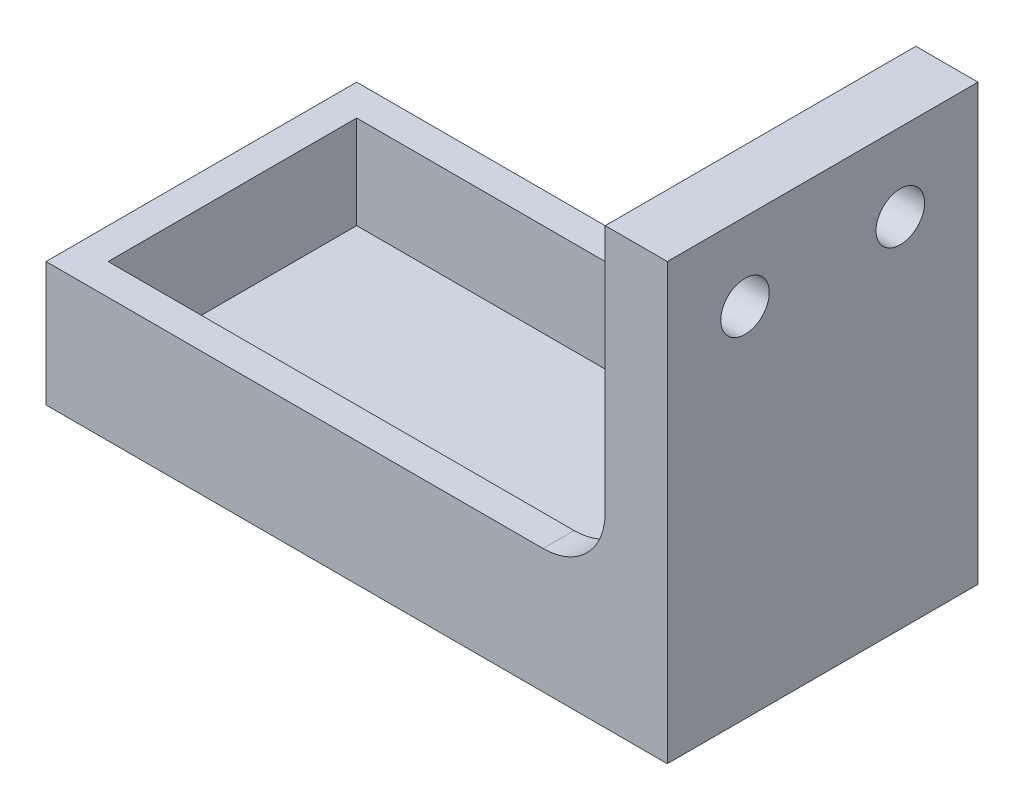
ISO-10303-21;
HEADER;
FILE_DESCRIPTION(('STEP AP214'),'2;1');
FILE_NAME('part.step','',(''),(''),'','','');
FILE_SCHEMA(('AUTOMOTIVE_DESIGN { 1 0 10303 214 1 1 1 1 }'));
ENDSEC;
DATA;
#1=APPLICATION_CONTEXT('core data for automotive mechanical design processes');
#2=APPLICATION_PROTOCOL_DEFINITION('international standard','automotive_design',2000,#1);
#3=PRODUCT_CONTEXT('',#1,'mechanical');
#4=PRODUCT('Part','Part','',(#3));
#5=PRODUCT_RELATED_PRODUCT_CATEGORY('part','',(#4));
#6=PRODUCT_DEFINITION_FORMATION('','',#4);
#7=PRODUCT_DEFINITION_CONTEXT('part definition',#1,'design');
#8=PRODUCT_DEFINITION('design','',#6,#7);
#9=PRODUCT_DEFINITION_SHAPE('','',#8);
#10=(LENGTH_UNIT() NAMED_UNIT(*) SI_UNIT(.MILLI.,.METRE.));
#11=(NAMED_UNIT(*) PLANE_ANGLE_UNIT() SI_UNIT($,.RADIAN.));
#12=(NAMED_UNIT(*) SI_UNIT($,.STERADIAN.) SOLID_ANGLE_UNIT());
#13=UNCERTAINTY_MEASURE_WITH_UNIT(LENGTH_MEASURE(1.E-05),#10,'distance_accuracy_value','');
#14=(GEOMETRIC_REPRESENTATION_CONTEXT(3) GLOBAL_UNCERTAINTY_ASSIGNED_CONTEXT((#13)) GLOBAL_UNIT_ASSIGNED_CONTEXT((#10,
#11,#12)) REPRESENTATION_CONTEXT('',''));
#15=CARTESIAN_POINT('',(0.,0.,0.));
#16=DIRECTION('',(0.,0.,1.));
#17=DIRECTION('',(1.,0.,0.));
#18=AXIS2_PLACEMENT_3D('',#15,#16,#17);
#19=CARTESIAN_POINT('',(-22.86,10.16,-25.4));
#20=DIRECTION('',(1.,0.,0.));
#21=DIRECTION('',(0.,0.,-1.));
#22=AXIS2_PLACEMENT_3D('',#19,#20,#21);
#23=PLANE('',#22);
#24=DIRECTION('',(0.,0.,1.));
#25=VECTOR('',#24,1.);
#26=CARTESIAN_POINT('',(-22.86,0.,-25.4));
#27=LINE('',#26,#25);
#28=CARTESIAN_POINT('',(-22.86,0.,-25.4));
#29=VERTEX_POINT('',#28);
#30=CARTESIAN_POINT('',(-22.86,0.,0.));
#31=VERTEX_POINT('',#30);
#32=EDGE_CURVE('E161',#29,#31,#27,.T.);
#33=ORIENTED_EDGE('',*,*,#32,.T.);
#34=DIRECTION('',(0.,-1.,0.));
#35=VECTOR('',#34,1.);
#36=CARTESIAN_POINT('',(-22.86,10.16,0.));
#37=LINE('',#36,#35);
#38=CARTESIAN_POINT('',(-22.86,10.16,0.));
#39=VERTEX_POINT('',#38);
#40=EDGE_CURVE('E196',#39,#31,#37,.T.);
#41=ORIENTED_EDGE('',*,*,#40,.F.);
#42=DIRECTION('',(0.,0.,1.));
#43=VECTOR('',#42,1.);
#44=CARTESIAN_POINT('',(-22.86,10.16,-25.4));
#45=LINE('',#44,#43);
#46=CARTESIAN_POINT('',(-22.86,10.16,-25.4));
#47=VERTEX_POINT('',#46);
#48=EDGE_CURVE('E179',#47,#39,#45,.T.);
#49=ORIENTED_EDGE('',*,*,#48,.F.);
#50=DIRECTION('',(0.,-1.,0.));
#51=VECTOR('',#50,1.);
#52=CARTESIAN_POINT('',(-22.86,10.16,-25.4));
#53=LINE('',#52,#51);
#54=EDGE_CURVE('E188',#47,#29,#53,.T.);
#55=ORIENTED_EDGE('',*,*,#54,.T.);
#56=EDGE_LOOP('',(#33,#41,#49,#55));
#57=FACE_BOUND('',#56,.T.);
#58=ADVANCED_FACE('F33',(#57),#23,.F.);
#59=CARTESIAN_POINT('',(-22.86,10.16,0.));
#60=DIRECTION('',(0.,0.,-1.));
#61=DIRECTION('',(-1.,0.,0.));
#62=AXIS2_PLACEMENT_3D('',#59,#60,#61);
#63=PLANE('',#62);
#64=DIRECTION('',(1.,0.,0.));
#65=VECTOR('',#64,1.);
#66=CARTESIAN_POINT('',(-22.86,0.,0.));
#67=LINE('',#66,#65);
#68=CARTESIAN_POINT('',(27.94,0.,0.));
#69=VERTEX_POINT('',#68);
#70=EDGE_CURVE('E191',#31,#69,#67,.T.);
#71=ORIENTED_EDGE('',*,*,#70,.T.);
#72=DIRECTION('',(0.,-1.,0.));
#73=VECTOR('',#72,1.);
#74=CARTESIAN_POINT('',(27.94,0.,0.));
#75=LINE('',#74,#73);
#76=CARTESIAN_POINT('',(27.94,35.56,0.));
#77=VERTEX_POINT('',#76);
#78=EDGE_CURVE('E135',#77,#69,#75,.T.);
#79=ORIENTED_EDGE('',*,*,#78,.F.);
#80=DIRECTION('',(-1.,0.,0.));
#81=VECTOR('',#80,1.);
#82=CARTESIAN_POINT('',(27.94,35.56,0.));
#83=LINE('',#82,#81);
#84=CARTESIAN_POINT('',(22.86,35.56,0.));
#85=VERTEX_POINT('',#84);
#86=EDGE_CURVE('E131',#77,#85,#83,.T.);
#87=ORIENTED_EDGE('',*,*,#86,.T.);
#88=DIRECTION('',(0.,-1.,0.));
#89=VECTOR('',#88,1.);
#90=CARTESIAN_POINT('',(22.86,0.,0.));
#91=LINE('',#90,#89);
#92=CARTESIAN_POINT('',(22.86,15.24,0.));
#93=VERTEX_POINT('',#92);
#94=EDGE_CURVE('E144',#85,#93,#91,.T.);
#95=ORIENTED_EDGE('',*,*,#94,.T.);
#96=CARTESIAN_POINT('',(17.78,15.24,0.));
#97=DIRECTION('',(0.,0.,-1.));
#98=DIRECTION('',(-1.,0.,0.));
#99=AXIS2_PLACEMENT_3D('',#96,#97,#98);
#100=CIRCLE('',#99,5.08);
#101=CARTESIAN_POINT('',(17.78,10.16,0.));
#102=VERTEX_POINT('',#101);
#103=EDGE_CURVE('E11',#93,#102,#100,.T.);
#104=ORIENTED_EDGE('',*,*,#103,.T.);
#105=DIRECTION('',(1.,0.,0.));
#106=VECTOR('',#105,1.);
#107=CARTESIAN_POINT('',(-22.86,10.16,0.));
#108=LINE('',#107,#106);
#109=EDGE_CURVE('E182',#39,#102,#108,.T.);
#110=ORIENTED_EDGE('',*,*,#109,.F.);
#111=ORIENTED_EDGE('',*,*,#40,.T.);
#112=EDGE_LOOP('',(#71,#79,#87,#95,#104,#110,#111));
#113=FACE_BOUND('',#112,.T.);
#114=ADVANCED_FACE('F234',(#113),#63,.F.);
#115=CARTESIAN_POINT('',(-22.86,10.16,-25.4));
#116=DIRECTION('',(0.,0.,1.));
#117=DIRECTION('',(1.,0.,0.));
#118=AXIS2_PLACEMENT_3D('',#115,#116,#117);
#119=PLANE('',#118);
#120=DIRECTION('',(-1.,0.,0.));
#121=VECTOR('',#120,1.);
#122=CARTESIAN_POINT('',(-22.86,0.,-25.4));
#123=LINE('',#122,#121);
#124=CARTESIAN_POINT('',(27.94,0.,-25.4));
#125=VERTEX_POINT('',#124);
#126=EDGE_CURVE('E183',#125,#29,#123,.T.);
#127=ORIENTED_EDGE('',*,*,#126,.T.);
#128=ORIENTED_EDGE('',*,*,#54,.F.);
#129=DIRECTION('',(-1.,0.,0.));
#130=VECTOR('',#129,1.);
#131=CARTESIAN_POINT('',(-22.86,10.16,-25.4));
#132=LINE('',#131,#130);
#133=CARTESIAN_POINT('',(17.78,10.16,-25.4));
#134=VERTEX_POINT('',#133);
#135=EDGE_CURVE('E186',#134,#47,#132,.T.);
#136=ORIENTED_EDGE('',*,*,#135,.F.);
#137=CARTESIAN_POINT('',(17.78,15.24,-25.4));
#138=DIRECTION('',(0.,0.,1.));
#139=DIRECTION('',(1.,0.,0.));
#140=AXIS2_PLACEMENT_3D('',#137,#138,#139);
#141=CIRCLE('',#140,5.08);
#142=CARTESIAN_POINT('',(22.86,15.24,-25.4));
#143=VERTEX_POINT('',#142);
#144=EDGE_CURVE('E42',#134,#143,#141,.T.);
#145=ORIENTED_EDGE('',*,*,#144,.T.);
#146=DIRECTION('',(0.,1.,0.));
#147=VECTOR('',#146,1.);
#148=CARTESIAN_POINT('',(22.86,0.,-25.4));
#149=LINE('',#148,#147);
#150=CARTESIAN_POINT('',(22.86,35.56,-25.4));
#151=VERTEX_POINT('',#150);
#152=EDGE_CURVE('E148',#143,#151,#149,.T.);
#153=ORIENTED_EDGE('',*,*,#152,.T.);
#154=DIRECTION('',(-1.,0.,0.));
#155=VECTOR('',#154,1.);
#156=CARTESIAN_POINT('',(27.94,35.56,-25.4));
#157=LINE('',#156,#155);
#158=CARTESIAN_POINT('',(27.94,35.56,-25.4));
#159=VERTEX_POINT('',#158);
#160=EDGE_CURVE('E129',#159,#151,#157,.T.);
#161=ORIENTED_EDGE('',*,*,#160,.F.);
#162=DIRECTION('',(0.,1.,0.));
#163=VECTOR('',#162,1.);
#164=CARTESIAN_POINT('',(27.94,0.,-25.4));
#165=LINE('',#164,#163);
#166=EDGE_CURVE('E136',#125,#159,#165,.T.);
#167=ORIENTED_EDGE('',*,*,#166,.F.);
#168=EDGE_LOOP('',(#127,#128,#136,#145,#153,#161,#167));
#169=FACE_BOUND('',#168,.T.);
#170=ADVANCED_FACE('F146',(#169),#119,.F.);
#171=CARTESIAN_POINT('',(0.,10.16,0.));
#172=DIRECTION('',(0.,1.,0.));
#173=DIRECTION('',(0.,0.,1.));
#174=AXIS2_PLACEMENT_3D('',#171,#172,#173);
#175=PLANE('',#174);
#176=ORIENTED_EDGE('',*,*,#109,.T.);
#177=DIRECTION('',(0.,0.,-1.));
#178=VECTOR('',#177,1.);
#179=CARTESIAN_POINT('',(17.78,10.16,0.));
#180=LINE('',#179,#178);
#181=CARTESIAN_POINT('',(17.78,10.16,-2.54));
#182=VERTEX_POINT('',#181);
#183=EDGE_CURVE('E201',#102,#182,#180,.T.);
#184=ORIENTED_EDGE('',*,*,#183,.T.);
#185=DIRECTION('',(1.,0.,0.));
#186=VECTOR('',#185,1.);
#187=CARTESIAN_POINT('',(-22.86,10.16,-2.54));
#188=LINE('',#187,#186);
#189=CARTESIAN_POINT('',(-20.32,10.16,-2.54));
#190=VERTEX_POINT('',#189);
#191=EDGE_CURVE('E175',#190,#182,#188,.T.);
#192=ORIENTED_EDGE('',*,*,#191,.F.);
#193=DIRECTION('',(0.,0.,1.));
#194=VECTOR('',#193,1.);
#195=CARTESIAN_POINT('',(-20.32,10.16,-25.4));
#196=LINE('',#195,#194);
#197=CARTESIAN_POINT('',(-20.32,10.16,-22.86));
#198=VERTEX_POINT('',#197);
#199=EDGE_CURVE('E173',#198,#190,#196,.T.);
#200=ORIENTED_EDGE('',*,*,#199,.F.);
#201=DIRECTION('',(-1.,0.,0.));
#202=VECTOR('',#201,1.);
#203=CARTESIAN_POINT('',(-22.86,10.16,-22.86));
#204=LINE('',#203,#202);
#205=CARTESIAN_POINT('',(17.78,10.16,-22.86));
#206=VERTEX_POINT('',#205);
#207=EDGE_CURVE('E165',#206,#198,#204,.T.);
#208=ORIENTED_EDGE('',*,*,#207,.F.);
#209=DIRECTION('',(0.,0.,-1.));
#210=VECTOR('',#209,1.);
#211=CARTESIAN_POINT('',(17.78,10.16,0.));
#212=LINE('',#211,#210);
#213=EDGE_CURVE('E199',#206,#134,#212,.T.);
#214=ORIENTED_EDGE('',*,*,#213,.T.);
#215=ORIENTED_EDGE('',*,*,#135,.T.);
#216=ORIENTED_EDGE('',*,*,#48,.T.);
#217=EDGE_LOOP('',(#176,#184,#192,#200,#208,#214,#215,#216));
#218=FACE_BOUND('',#217,.T.);
#219=ADVANCED_FACE('F243',(#218),#175,.T.);
#220=CARTESIAN_POINT('',(0.,0.,0.));
#221=DIRECTION('',(0.,1.,0.));
#222=DIRECTION('',(0.,0.,1.));
#223=AXIS2_PLACEMENT_3D('',#220,#221,#222);
#224=PLANE('',#223);
#225=ORIENTED_EDGE('',*,*,#32,.F.);
#226=ORIENTED_EDGE('',*,*,#126,.F.);
#227=DIRECTION('',(0.,0.,-1.));
#228=VECTOR('',#227,1.);
#229=CARTESIAN_POINT('',(27.94,0.,-25.4));
#230=LINE('',#229,#228);
#231=EDGE_CURVE('E142',#69,#125,#230,.T.);
#232=ORIENTED_EDGE('',*,*,#231,.F.);
#233=ORIENTED_EDGE('',*,*,#70,.F.);
#234=EDGE_LOOP('',(#225,#226,#232,#233));
#235=FACE_BOUND('',#234,.T.);
#236=ADVANCED_FACE('F280',(#235),#224,.F.);
#237=CARTESIAN_POINT('',(-20.32,10.16,-25.4));
#238=DIRECTION('',(1.,0.,0.));
#239=DIRECTION('',(0.,0.,-1.));
#240=AXIS2_PLACEMENT_3D('',#237,#238,#239);
#241=PLANE('',#240);
#242=DIRECTION('',(0.,0.,1.));
#243=VECTOR('',#242,1.);
#244=CARTESIAN_POINT('',(-20.32,2.54,-25.4));
#245=LINE('',#244,#243);
#246=CARTESIAN_POINT('',(-20.32,2.54,-22.86));
#247=VERTEX_POINT('',#246);
#248=CARTESIAN_POINT('',(-20.32,2.54,-2.54));
#249=VERTEX_POINT('',#248);
#250=EDGE_CURVE('E150',#247,#249,#245,.T.);
#251=ORIENTED_EDGE('',*,*,#250,.F.);
#252=DIRECTION('',(0.,-1.,0.));
#253=VECTOR('',#252,1.);
#254=CARTESIAN_POINT('',(-20.32,10.16,-22.86));
#255=LINE('',#254,#253);
#256=EDGE_CURVE('E162',#198,#247,#255,.T.);
#257=ORIENTED_EDGE('',*,*,#256,.F.);
#258=ORIENTED_EDGE('',*,*,#199,.T.);
#259=DIRECTION('',(0.,-1.,0.));
#260=VECTOR('',#259,1.);
#261=CARTESIAN_POINT('',(-20.32,10.16,-2.54));
#262=LINE('',#261,#260);
#263=EDGE_CURVE('E158',#190,#249,#262,.T.);
#264=ORIENTED_EDGE('',*,*,#263,.T.);
#265=EDGE_LOOP('',(#251,#257,#258,#264));
#266=FACE_BOUND('',#265,.T.);
#267=ADVANCED_FACE('F250',(#266),#241,.T.);
#268=CARTESIAN_POINT('',(-22.86,10.16,-2.54));
#269=DIRECTION('',(0.,0.,-1.));
#270=DIRECTION('',(-1.,0.,0.));
#271=AXIS2_PLACEMENT_3D('',#268,#269,#270);
#272=PLANE('',#271);
#273=DIRECTION('',(1.,0.,0.));
#274=VECTOR('',#273,1.);
#275=CARTESIAN_POINT('',(-22.86,2.54,-2.54));
#276=LINE('',#275,#274);
#277=CARTESIAN_POINT('',(20.32,2.54,-2.54));
#278=VERTEX_POINT('',#277);
#279=EDGE_CURVE('E153',#249,#278,#276,.T.);
#280=ORIENTED_EDGE('',*,*,#279,.F.);
#281=ORIENTED_EDGE('',*,*,#263,.F.);
#282=ORIENTED_EDGE('',*,*,#191,.T.);
#283=CARTESIAN_POINT('',(17.78,15.24,-2.54));
#284=DIRECTION('',(0.,0.,-1.));
#285=DIRECTION('',(-1.,0.,0.));
#286=AXIS2_PLACEMENT_3D('',#283,#284,#285);
#287=CIRCLE('',#286,5.08);
#288=CARTESIAN_POINT('',(20.32,10.8405909487751,-2.54));
#289=VERTEX_POINT('',#288);
#290=EDGE_CURVE('E206',#182,#289,#287,.F.);
#291=ORIENTED_EDGE('',*,*,#290,.T.);
#292=DIRECTION('',(0.,-1.,0.));
#293=VECTOR('',#292,1.);
#294=CARTESIAN_POINT('',(20.32,10.16,-2.54));
#295=LINE('',#294,#293);
#296=EDGE_CURVE('E57',#289,#278,#295,.T.);
#297=ORIENTED_EDGE('',*,*,#296,.T.);
#298=EDGE_LOOP('',(#280,#281,#282,#291,#297));
#299=FACE_BOUND('',#298,.T.);
#300=ADVANCED_FACE('F247',(#299),#272,.T.);
#301=CARTESIAN_POINT('',(20.32,10.16,-25.4));
#302=DIRECTION('',(-1.,0.,0.));
#303=DIRECTION('',(0.,0.,1.));
#304=AXIS2_PLACEMENT_3D('',#301,#302,#303);
#305=PLANE('',#304);
#306=DIRECTION('',(0.,0.,-1.));
#307=VECTOR('',#306,1.);
#308=CARTESIAN_POINT('',(20.32,2.54,-25.4));
#309=LINE('',#308,#307);
#310=CARTESIAN_POINT('',(20.32,2.54,-22.86));
#311=VERTEX_POINT('',#310);
#312=EDGE_CURVE('E167',#278,#311,#309,.T.);
#313=ORIENTED_EDGE('',*,*,#312,.F.);
#314=ORIENTED_EDGE('',*,*,#296,.F.);
#315=DIRECTION('',(0.,0.,-1.));
#316=VECTOR('',#315,1.);
#317=CARTESIAN_POINT('',(20.32,10.8405909487751,-2.54));
#318=LINE('',#317,#316);
#319=CARTESIAN_POINT('',(20.32,10.8405909487751,-22.86));
#320=VERTEX_POINT('',#319);
#321=EDGE_CURVE('E208',#289,#320,#318,.T.);
#322=ORIENTED_EDGE('',*,*,#321,.T.);
#323=DIRECTION('',(0.,-1.,0.));
#324=VECTOR('',#323,1.);
#325=CARTESIAN_POINT('',(20.32,10.16,-22.86));
#326=LINE('',#325,#324);
#327=EDGE_CURVE('E50',#320,#311,#326,.T.);
#328=ORIENTED_EDGE('',*,*,#327,.T.);
#329=EDGE_LOOP('',(#313,#314,#322,#328));
#330=FACE_BOUND('',#329,.T.);
#331=ADVANCED_FACE('F290',(#330),#305,.T.);
#332=CARTESIAN_POINT('',(-22.86,10.16,-22.86));
#333=DIRECTION('',(0.,0.,1.));
#334=DIRECTION('',(1.,0.,0.));
#335=AXIS2_PLACEMENT_3D('',#332,#333,#334);
#336=PLANE('',#335);
#337=DIRECTION('',(-1.,0.,0.));
#338=VECTOR('',#337,1.);
#339=CARTESIAN_POINT('',(-22.86,2.54,-22.86));
#340=LINE('',#339,#338);
#341=EDGE_CURVE('E170',#311,#247,#340,.T.);
#342=ORIENTED_EDGE('',*,*,#341,.F.);
#343=ORIENTED_EDGE('',*,*,#327,.F.);
#344=CARTESIAN_POINT('',(17.78,15.24,-22.86));
#345=DIRECTION('',(0.,0.,1.));
#346=DIRECTION('',(1.,0.,0.));
#347=AXIS2_PLACEMENT_3D('',#344,#345,#346);
#348=CIRCLE('',#347,5.08);
#349=EDGE_CURVE('E210',#320,#206,#348,.F.);
#350=ORIENTED_EDGE('',*,*,#349,.T.);
#351=ORIENTED_EDGE('',*,*,#207,.T.);
#352=ORIENTED_EDGE('',*,*,#256,.T.);
#353=EDGE_LOOP('',(#342,#343,#350,#351,#352));
#354=FACE_BOUND('',#353,.T.);
#355=ADVANCED_FACE('F254',(#354),#336,.T.);
#356=CARTESIAN_POINT('',(0.,2.54,0.));
#357=DIRECTION('',(0.,1.,0.));
#358=DIRECTION('',(0.,0.,1.));
#359=AXIS2_PLACEMENT_3D('',#356,#357,#358);
#360=PLANE('',#359);
#361=ORIENTED_EDGE('',*,*,#250,.T.);
#362=ORIENTED_EDGE('',*,*,#279,.T.);
#363=ORIENTED_EDGE('',*,*,#312,.T.);
#364=ORIENTED_EDGE('',*,*,#341,.T.);
#365=EDGE_LOOP('',(#361,#362,#363,#364));
#366=FACE_BOUND('',#365,.T.);
#367=ADVANCED_FACE('F253',(#366),#360,.T.);
#368=CARTESIAN_POINT('',(27.94,35.56,-25.4));
#369=DIRECTION('',(0.,-1.,0.));
#370=DIRECTION('',(0.,0.,-1.));
#371=AXIS2_PLACEMENT_3D('',#368,#369,#370);
#372=PLANE('',#371);
#373=DIRECTION('',(0.,0.,1.));
#374=VECTOR('',#373,1.);
#375=CARTESIAN_POINT('',(22.86,35.56,-25.4));
#376=LINE('',#375,#374);
#377=EDGE_CURVE('E229',#151,#85,#376,.T.);
#378=ORIENTED_EDGE('',*,*,#377,.T.);
#379=ORIENTED_EDGE('',*,*,#86,.F.);
#380=DIRECTION('',(0.,0.,1.));
#381=VECTOR('',#380,1.);
#382=CARTESIAN_POINT('',(27.94,35.56,-25.4));
#383=LINE('',#382,#381);
#384=EDGE_CURVE('E125',#159,#77,#383,.T.);
#385=ORIENTED_EDGE('',*,*,#384,.F.);
#386=ORIENTED_EDGE('',*,*,#160,.T.);
#387=EDGE_LOOP('',(#378,#379,#385,#386));
#388=FACE_BOUND('',#387,.T.);
#389=ADVANCED_FACE('F127',(#388),#372,.F.);
#390=CARTESIAN_POINT('',(27.94,0.,0.));
#391=DIRECTION('',(1.,0.,0.));
#392=DIRECTION('',(0.,0.,-1.));
#393=AXIS2_PLACEMENT_3D('',#390,#391,#392);
#394=PLANE('',#393);
#395=CARTESIAN_POINT('',(27.94,29.21,-19.05));
#396=DIRECTION('',(-1.,0.,0.));
#397=DIRECTION('',(0.,0.,1.));
#398=AXIS2_PLACEMENT_3D('',#395,#396,#397);
#399=CIRCLE('',#398,1.984375);
#400=CARTESIAN_POINT('',(27.94,29.21,-17.065625));
#401=VERTEX_POINT('',#400);
#402=EDGE_CURVE('E214',#401,#401,#399,.T.);
#403=ORIENTED_EDGE('',*,*,#402,.T.);
#404=EDGE_LOOP('',(#403));
#405=FACE_BOUND('',#404,.T.);
#406=CARTESIAN_POINT('',(27.94,29.21,-6.35));
#407=DIRECTION('',(-1.,0.,0.));
#408=DIRECTION('',(0.,0.,1.));
#409=AXIS2_PLACEMENT_3D('',#406,#407,#408);
#410=CIRCLE('',#409,1.984375);
#411=CARTESIAN_POINT('',(27.94,29.21,-4.365625));
#412=VERTEX_POINT('',#411);
#413=EDGE_CURVE('E219',#412,#412,#410,.T.);
#414=ORIENTED_EDGE('',*,*,#413,.T.);
#415=EDGE_LOOP('',(#414));
#416=FACE_BOUND('',#415,.T.);
#417=ORIENTED_EDGE('',*,*,#166,.T.);
#418=ORIENTED_EDGE('',*,*,#384,.T.);
#419=ORIENTED_EDGE('',*,*,#78,.T.);
#420=ORIENTED_EDGE('',*,*,#231,.T.);
#421=EDGE_LOOP('',(#417,#418,#419,#420));
#422=FACE_BOUND('',#421,.T.);
#423=ADVANCED_FACE('F140',(#405,#416,#422),#394,.T.);
#424=CARTESIAN_POINT('',(22.86,0.,0.));
#425=DIRECTION('',(1.,0.,0.));
#426=DIRECTION('',(0.,0.,-1.));
#427=AXIS2_PLACEMENT_3D('',#424,#425,#426);
#428=PLANE('',#427);
#429=CARTESIAN_POINT('',(22.86,29.21,-19.05));
#430=DIRECTION('',(1.,0.,0.));
#431=DIRECTION('',(0.,0.,-1.));
#432=AXIS2_PLACEMENT_3D('',#429,#430,#431);
#433=CIRCLE('',#432,1.984375);
#434=CARTESIAN_POINT('',(22.86,29.21,-21.034375));
#435=VERTEX_POINT('',#434);
#436=EDGE_CURVE('E37',#435,#435,#433,.T.);
#437=ORIENTED_EDGE('',*,*,#436,.T.);
#438=EDGE_LOOP('',(#437));
#439=FACE_BOUND('',#438,.T.);
#440=CARTESIAN_POINT('',(22.86,29.21,-6.35));
#441=DIRECTION('',(1.,0.,0.));
#442=DIRECTION('',(0.,0.,-1.));
#443=AXIS2_PLACEMENT_3D('',#440,#441,#442);
#444=CIRCLE('',#443,1.984375);
#445=CARTESIAN_POINT('',(22.86,29.21,-8.334375));
#446=VERTEX_POINT('',#445);
#447=EDGE_CURVE('E212',#446,#446,#444,.T.);
#448=ORIENTED_EDGE('',*,*,#447,.T.);
#449=EDGE_LOOP('',(#448));
#450=FACE_BOUND('',#449,.T.);
#451=ORIENTED_EDGE('',*,*,#152,.F.);
#452=DIRECTION('',(0.,0.,-1.));
#453=VECTOR('',#452,1.);
#454=CARTESIAN_POINT('',(22.86,15.24,0.));
#455=LINE('',#454,#453);
#456=EDGE_CURVE('E204',#143,#93,#455,.F.);
#457=ORIENTED_EDGE('',*,*,#456,.T.);
#458=ORIENTED_EDGE('',*,*,#94,.F.);
#459=ORIENTED_EDGE('',*,*,#377,.F.);
#460=EDGE_LOOP('',(#451,#457,#458,#459));
#461=FACE_BOUND('',#460,.T.);
#462=ADVANCED_FACE('F260',(#439,#450,#461),#428,.F.);
#463=CARTESIAN_POINT('',(17.78,15.24,0.));
#464=DIRECTION('',(0.,0.,-1.));
#465=DIRECTION('',(-1.,0.,0.));
#466=AXIS2_PLACEMENT_3D('',#463,#464,#465);
#467=CYLINDRICAL_SURFACE('',#466,5.08);
#468=ORIENTED_EDGE('',*,*,#103,.F.);
#469=ORIENTED_EDGE('',*,*,#456,.F.);
#470=ORIENTED_EDGE('',*,*,#144,.F.);
#471=ORIENTED_EDGE('',*,*,#213,.F.);
#472=ORIENTED_EDGE('',*,*,#349,.F.);
#473=ORIENTED_EDGE('',*,*,#321,.F.);
#474=ORIENTED_EDGE('',*,*,#290,.F.);
#475=ORIENTED_EDGE('',*,*,#183,.F.);
#476=EDGE_LOOP('',(#468,#469,#470,#471,#472,#473,#474,#475));
#477=FACE_BOUND('',#476,.T.);
#478=ADVANCED_FACE('F35',(#477),#467,.F.);
#479=CARTESIAN_POINT('',(27.94,29.21,-6.35));
#480=DIRECTION('',(-1.,0.,0.));
#481=DIRECTION('',(0.,0.,1.));
#482=AXIS2_PLACEMENT_3D('',#479,#480,#481);
#483=CYLINDRICAL_SURFACE('',#482,1.984375);
#484=ORIENTED_EDGE('',*,*,#413,.F.);
#485=EDGE_LOOP('',(#484));
#486=FACE_BOUND('',#485,.T.);
#487=ORIENTED_EDGE('',*,*,#447,.F.);
#488=EDGE_LOOP('',(#487));
#489=FACE_BOUND('',#488,.T.);
#490=ADVANCED_FACE('F268',(#486,#489),#483,.F.);
#491=CARTESIAN_POINT('',(27.94,29.21,-19.05));
#492=DIRECTION('',(-1.,0.,0.));
#493=DIRECTION('',(0.,0.,1.));
#494=AXIS2_PLACEMENT_3D('',#491,#492,#493);
#495=CYLINDRICAL_SURFACE('',#494,1.984375);
#496=ORIENTED_EDGE('',*,*,#402,.F.);
#497=EDGE_LOOP('',(#496));
#498=FACE_BOUND('',#497,.T.);
#499=ORIENTED_EDGE('',*,*,#436,.F.);
#500=EDGE_LOOP('',(#499));
#501=FACE_BOUND('',#500,.T.);
#502=ADVANCED_FACE('F324',(#498,#501),#495,.F.);
#503=CLOSED_SHELL('',(#58,#114,#170,#219,#236,#267,#300,#331,#355,#367,#389,#423,#462,#478,#490,#502));
#504=MANIFOLD_SOLID_BREP('B2',#503);
#505=ADVANCED_BREP_SHAPE_REPRESENTATION('',(#18,#504),#14);
#506=SHAPE_DEFINITION_REPRESENTATION(#9,#505);
ENDSEC;
END-ISO-10303-21;
